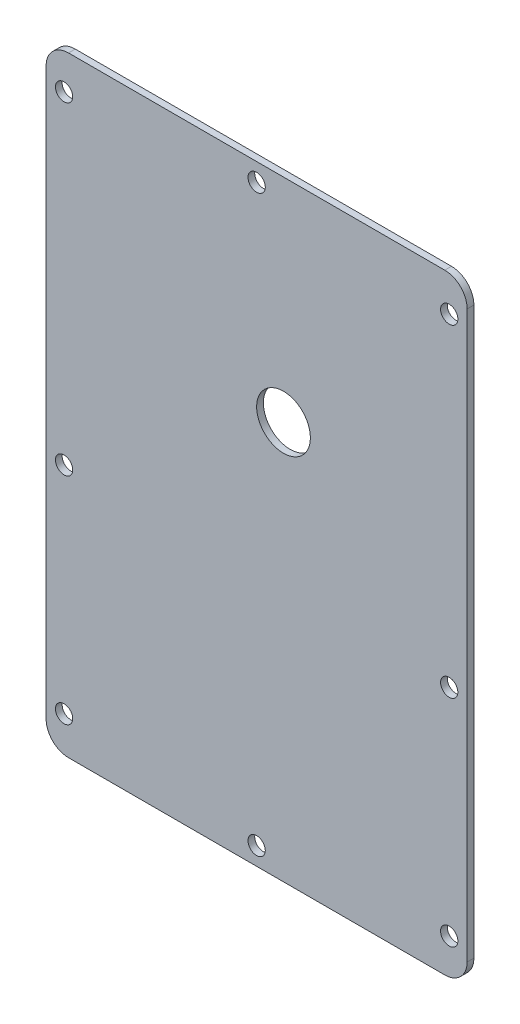
ISO-10303-21;
HEADER;
FILE_DESCRIPTION(('STEP AP214'),'2;1');
FILE_NAME('part.step','',(''),(''),'','','');
FILE_SCHEMA(('AUTOMOTIVE_DESIGN { 1 0 10303 214 1 1 1 1 }'));
ENDSEC;
DATA;
#1=APPLICATION_CONTEXT('core data for automotive mechanical design processes');
#2=APPLICATION_PROTOCOL_DEFINITION('international standard','automotive_design',2000,#1);
#3=PRODUCT_CONTEXT('',#1,'mechanical');
#4=PRODUCT('Part','Part','',(#3));
#5=PRODUCT_RELATED_PRODUCT_CATEGORY('part','',(#4));
#6=PRODUCT_DEFINITION_FORMATION('','',#4);
#7=PRODUCT_DEFINITION_CONTEXT('part definition',#1,'design');
#8=PRODUCT_DEFINITION('design','',#6,#7);
#9=PRODUCT_DEFINITION_SHAPE('','',#8);
#10=(LENGTH_UNIT() NAMED_UNIT(*) SI_UNIT(.MILLI.,.METRE.));
#11=(NAMED_UNIT(*) PLANE_ANGLE_UNIT() SI_UNIT($,.RADIAN.));
#12=(NAMED_UNIT(*) SI_UNIT($,.STERADIAN.) SOLID_ANGLE_UNIT());
#13=UNCERTAINTY_MEASURE_WITH_UNIT(LENGTH_MEASURE(1.E-05),#10,'distance_accuracy_value','');
#14=(GEOMETRIC_REPRESENTATION_CONTEXT(3) GLOBAL_UNCERTAINTY_ASSIGNED_CONTEXT((#13)) GLOBAL_UNIT_ASSIGNED_CONTEXT((#10,
#11,#12)) REPRESENTATION_CONTEXT('',''));
#15=CARTESIAN_POINT('',(0.,0.,0.));
#16=DIRECTION('',(0.,0.,1.));
#17=DIRECTION('',(1.,0.,0.));
#18=AXIS2_PLACEMENT_3D('',#15,#16,#17);
#19=CARTESIAN_POINT('',(47.0195351846494,-9.76000328568767,1.5));
#20=DIRECTION('',(-1.,0.,0.));
#21=DIRECTION('',(0.,0.,1.));
#22=AXIS2_PLACEMENT_3D('',#19,#20,#21);
#23=PLANE('',#22);
#24=DIRECTION('',(0.,1.,0.));
#25=VECTOR('',#24,1.);
#26=CARTESIAN_POINT('',(47.0195351846494,-9.76000328568767,1.5));
#27=LINE('',#26,#25);
#28=CARTESIAN_POINT('',(47.0195351846494,-4.76000328568767,1.5));
#29=VERTEX_POINT('',#28);
#30=CARTESIAN_POINT('',(47.0195351846494,121.572094853352,1.5));
#31=VERTEX_POINT('',#30);
#32=EDGE_CURVE('E132',#29,#31,#27,.T.);
#33=ORIENTED_EDGE('',*,*,#32,.F.);
#34=DIRECTION('',(0.,0.,-1.));
#35=VECTOR('',#34,1.);
#36=CARTESIAN_POINT('',(47.0195351846494,-4.76000328568767,1.5));
#37=LINE('',#36,#35);
#38=CARTESIAN_POINT('',(47.0195351846494,-4.76000328568767,0.));
#39=VERTEX_POINT('',#38);
#40=EDGE_CURVE('E117',#29,#39,#37,.T.);
#41=ORIENTED_EDGE('',*,*,#40,.T.);
#42=DIRECTION('',(0.,1.,0.));
#43=VECTOR('',#42,1.);
#44=CARTESIAN_POINT('',(47.0195351846494,-9.76000328568767,0.));
#45=LINE('',#44,#43);
#46=CARTESIAN_POINT('',(47.0195351846494,121.572094853352,0.));
#47=VERTEX_POINT('',#46);
#48=EDGE_CURVE('E129',#39,#47,#45,.T.);
#49=ORIENTED_EDGE('',*,*,#48,.T.);
#50=DIRECTION('',(0.,0.,-1.));
#51=VECTOR('',#50,1.);
#52=CARTESIAN_POINT('',(47.0195351846494,121.572094853352,1.5));
#53=LINE('',#52,#51);
#54=EDGE_CURVE('E134',#47,#31,#53,.F.);
#55=ORIENTED_EDGE('',*,*,#54,.T.);
#56=EDGE_LOOP('',(#33,#41,#49,#55));
#57=FACE_BOUND('',#56,.T.);
#58=ADVANCED_FACE('F45',(#57),#23,.F.);
#59=CARTESIAN_POINT('',(47.0195351846494,126.572094853352,1.5));
#60=DIRECTION('',(0.,-1.,0.));
#61=DIRECTION('',(0.,0.,-1.));
#62=AXIS2_PLACEMENT_3D('',#59,#60,#61);
#63=PLANE('',#62);
#64=DIRECTION('',(-1.,0.,0.));
#65=VECTOR('',#64,1.);
#66=CARTESIAN_POINT('',(47.0195351846494,126.572094853352,0.));
#67=LINE('',#66,#65);
#68=CARTESIAN_POINT('',(42.0195351846494,126.572094853352,0.));
#69=VERTEX_POINT('',#68);
#70=CARTESIAN_POINT('',(-42.0195351846494,126.572094853352,0.));
#71=VERTEX_POINT('',#70);
#72=EDGE_CURVE('E138',#69,#71,#67,.T.);
#73=ORIENTED_EDGE('',*,*,#72,.T.);
#74=DIRECTION('',(0.,0.,-1.));
#75=VECTOR('',#74,1.);
#76=CARTESIAN_POINT('',(-42.0195351846494,126.572094853352,1.5));
#77=LINE('',#76,#75);
#78=CARTESIAN_POINT('',(-42.0195351846494,126.572094853352,1.5));
#79=VERTEX_POINT('',#78);
#80=EDGE_CURVE('E11',#71,#79,#77,.F.);
#81=ORIENTED_EDGE('',*,*,#80,.T.);
#82=DIRECTION('',(-1.,0.,0.));
#83=VECTOR('',#82,1.);
#84=CARTESIAN_POINT('',(47.0195351846494,126.572094853352,1.5));
#85=LINE('',#84,#83);
#86=CARTESIAN_POINT('',(42.0195351846494,126.572094853352,1.5));
#87=VERTEX_POINT('',#86);
#88=EDGE_CURVE('E216',#87,#79,#85,.T.);
#89=ORIENTED_EDGE('',*,*,#88,.F.);
#90=DIRECTION('',(0.,0.,-1.));
#91=VECTOR('',#90,1.);
#92=CARTESIAN_POINT('',(42.0195351846494,126.572094853352,1.5));
#93=LINE('',#92,#91);
#94=EDGE_CURVE('E54',#87,#69,#93,.T.);
#95=ORIENTED_EDGE('',*,*,#94,.T.);
#96=EDGE_LOOP('',(#73,#81,#89,#95));
#97=FACE_BOUND('',#96,.T.);
#98=ADVANCED_FACE('F234',(#97),#63,.F.);
#99=CARTESIAN_POINT('',(-47.0195351846494,-9.76000328568767,1.5));
#100=DIRECTION('',(1.,0.,0.));
#101=DIRECTION('',(0.,0.,-1.));
#102=AXIS2_PLACEMENT_3D('',#99,#100,#101);
#103=PLANE('',#102);
#104=DIRECTION('',(0.,-1.,0.));
#105=VECTOR('',#104,1.);
#106=CARTESIAN_POINT('',(-47.0195351846494,-9.76000328568767,0.));
#107=LINE('',#106,#105);
#108=CARTESIAN_POINT('',(-47.0195351846494,121.572094853352,0.));
#109=VERTEX_POINT('',#108);
#110=CARTESIAN_POINT('',(-47.0195351846494,-4.76000328568767,0.));
#111=VERTEX_POINT('',#110);
#112=EDGE_CURVE('E142',#109,#111,#107,.T.);
#113=ORIENTED_EDGE('',*,*,#112,.T.);
#114=DIRECTION('',(0.,0.,-1.));
#115=VECTOR('',#114,1.);
#116=CARTESIAN_POINT('',(-47.0195351846494,-4.76000328568767,1.5));
#117=LINE('',#116,#115);
#118=CARTESIAN_POINT('',(-47.0195351846494,-4.76000328568767,1.5));
#119=VERTEX_POINT('',#118);
#120=EDGE_CURVE('E62',#111,#119,#117,.F.);
#121=ORIENTED_EDGE('',*,*,#120,.T.);
#122=DIRECTION('',(0.,-1.,0.));
#123=VECTOR('',#122,1.);
#124=CARTESIAN_POINT('',(-47.0195351846494,-9.76000328568767,1.5));
#125=LINE('',#124,#123);
#126=CARTESIAN_POINT('',(-47.0195351846494,121.572094853352,1.5));
#127=VERTEX_POINT('',#126);
#128=EDGE_CURVE('E217',#127,#119,#125,.T.);
#129=ORIENTED_EDGE('',*,*,#128,.F.);
#130=DIRECTION('',(0.,0.,-1.));
#131=VECTOR('',#130,1.);
#132=CARTESIAN_POINT('',(-47.0195351846494,121.572094853352,1.5));
#133=LINE('',#132,#131);
#134=EDGE_CURVE('E169',#127,#109,#133,.T.);
#135=ORIENTED_EDGE('',*,*,#134,.T.);
#136=EDGE_LOOP('',(#113,#121,#129,#135));
#137=FACE_BOUND('',#136,.T.);
#138=ADVANCED_FACE('F228',(#137),#103,.F.);
#139=CARTESIAN_POINT('',(47.0195351846494,-9.76000328568767,1.5));
#140=DIRECTION('',(0.,1.,0.));
#141=DIRECTION('',(0.,0.,1.));
#142=AXIS2_PLACEMENT_3D('',#139,#140,#141);
#143=PLANE('',#142);
#144=DIRECTION('',(1.,0.,0.));
#145=VECTOR('',#144,1.);
#146=CARTESIAN_POINT('',(47.0195351846494,-9.76000328568767,0.));
#147=LINE('',#146,#145);
#148=CARTESIAN_POINT('',(-42.0195351846494,-9.76000328568767,0.));
#149=VERTEX_POINT('',#148);
#150=CARTESIAN_POINT('',(42.0195351846494,-9.76000328568767,0.));
#151=VERTEX_POINT('',#150);
#152=EDGE_CURVE('E152',#149,#151,#147,.T.);
#153=ORIENTED_EDGE('',*,*,#152,.T.);
#154=DIRECTION('',(0.,0.,-1.));
#155=VECTOR('',#154,1.);
#156=CARTESIAN_POINT('',(42.0195351846494,-9.76000328568767,1.5));
#157=LINE('',#156,#155);
#158=CARTESIAN_POINT('',(42.0195351846494,-9.76000328568767,1.5));
#159=VERTEX_POINT('',#158);
#160=EDGE_CURVE('E118',#151,#159,#157,.F.);
#161=ORIENTED_EDGE('',*,*,#160,.T.);
#162=DIRECTION('',(1.,0.,0.));
#163=VECTOR('',#162,1.);
#164=CARTESIAN_POINT('',(47.0195351846494,-9.76000328568767,1.5));
#165=LINE('',#164,#163);
#166=CARTESIAN_POINT('',(-42.0195351846494,-9.76000328568767,1.5));
#167=VERTEX_POINT('',#166);
#168=EDGE_CURVE('E148',#167,#159,#165,.T.);
#169=ORIENTED_EDGE('',*,*,#168,.F.);
#170=DIRECTION('',(0.,0.,-1.));
#171=VECTOR('',#170,1.);
#172=CARTESIAN_POINT('',(-42.0195351846494,-9.76000328568767,1.5));
#173=LINE('',#172,#171);
#174=EDGE_CURVE('E123',#167,#149,#173,.T.);
#175=ORIENTED_EDGE('',*,*,#174,.T.);
#176=EDGE_LOOP('',(#153,#161,#169,#175));
#177=FACE_BOUND('',#176,.T.);
#178=ADVANCED_FACE('F224',(#177),#143,.F.);
#179=CARTESIAN_POINT('',(0.,0.,1.5));
#180=DIRECTION('',(0.,0.,1.));
#181=DIRECTION('',(1.,0.,0.));
#182=AXIS2_PLACEMENT_3D('',#179,#180,#181);
#183=PLANE('',#182);
#184=CARTESIAN_POINT('',(6.00001877293246,79.140018508034,1.5));
#185=DIRECTION('',(0.,0.,1.));
#186=DIRECTION('',(1.,0.,0.));
#187=AXIS2_PLACEMENT_3D('',#184,#185,#186);
#188=CIRCLE('',#187,6.00000000000001);
#189=CARTESIAN_POINT('',(12.0000187729325,79.140018508034,1.5));
#190=VERTEX_POINT('',#189);
#191=EDGE_CURVE('E411',#190,#190,#188,.T.);
#192=ORIENTED_EDGE('',*,*,#191,.F.);
#193=EDGE_LOOP('',(#192));
#194=FACE_BOUND('',#193,.T.);
#195=CARTESIAN_POINT('',(43.0097675923247,118.552559668702,1.5));
#196=DIRECTION('',(0.,0.,1.));
#197=DIRECTION('',(1.,0.,0.));
#198=AXIS2_PLACEMENT_3D('',#195,#196,#197);
#199=CIRCLE('',#198,1.93039999999999);
#200=CARTESIAN_POINT('',(44.9401675923247,118.552559668702,1.5));
#201=VERTEX_POINT('',#200);
#202=EDGE_CURVE('E415',#201,#201,#199,.T.);
#203=ORIENTED_EDGE('',*,*,#202,.F.);
#204=EDGE_LOOP('',(#203));
#205=FACE_BOUND('',#204,.T.);
#206=CARTESIAN_POINT('',(43.0097675923247,46.3767430068579,1.5));
#207=DIRECTION('',(0.,0.,1.));
#208=DIRECTION('',(1.,0.,0.));
#209=AXIS2_PLACEMENT_3D('',#206,#207,#208);
#210=CIRCLE('',#209,1.93039999999999);
#211=CARTESIAN_POINT('',(44.9401675923247,46.3767430068579,1.5));
#212=VERTEX_POINT('',#211);
#213=EDGE_CURVE('E196',#212,#212,#210,.T.);
#214=ORIENTED_EDGE('',*,*,#213,.F.);
#215=EDGE_LOOP('',(#214));
#216=FACE_BOUND('',#215,.T.);
#217=CARTESIAN_POINT('',(43.0097675923247,-1.74046810103833,1.5));
#218=DIRECTION('',(0.,0.,1.));
#219=DIRECTION('',(1.,0.,0.));
#220=AXIS2_PLACEMENT_3D('',#217,#218,#219);
#221=CIRCLE('',#220,1.93039999999999);
#222=CARTESIAN_POINT('',(44.9401675923247,-1.74046810103833,1.5));
#223=VERTEX_POINT('',#222);
#224=EDGE_CURVE('E185',#223,#223,#221,.T.);
#225=ORIENTED_EDGE('',*,*,#224,.F.);
#226=EDGE_LOOP('',(#225));
#227=FACE_BOUND('',#226,.T.);
#228=CARTESIAN_POINT('',(-43.0097675923247,46.3767430068579,1.5));
#229=DIRECTION('',(0.,0.,1.));
#230=DIRECTION('',(1.,0.,0.));
#231=AXIS2_PLACEMENT_3D('',#228,#229,#230);
#232=CIRCLE('',#231,1.93039999999999);
#233=CARTESIAN_POINT('',(-41.0793675923247,46.3767430068579,1.5));
#234=VERTEX_POINT('',#233);
#235=EDGE_CURVE('E182',#234,#234,#232,.T.);
#236=ORIENTED_EDGE('',*,*,#235,.F.);
#237=EDGE_LOOP('',(#236));
#238=FACE_BOUND('',#237,.T.);
#239=CARTESIAN_POINT('',(-43.0097675923247,-1.74046810103834,1.5));
#240=DIRECTION('',(0.,0.,1.));
#241=DIRECTION('',(1.,0.,0.));
#242=AXIS2_PLACEMENT_3D('',#239,#240,#241);
#243=CIRCLE('',#242,1.93039999999999);
#244=CARTESIAN_POINT('',(-41.0793675923247,-1.74046810103834,1.5));
#245=VERTEX_POINT('',#244);
#246=EDGE_CURVE('E179',#245,#245,#243,.T.);
#247=ORIENTED_EDGE('',*,*,#246,.F.);
#248=EDGE_LOOP('',(#247));
#249=FACE_BOUND('',#248,.T.);
#250=CARTESIAN_POINT('',(0.,122.562327261027,1.5));
#251=DIRECTION('',(0.,0.,1.));
#252=DIRECTION('',(1.,0.,0.));
#253=AXIS2_PLACEMENT_3D('',#250,#251,#252);
#254=CIRCLE('',#253,1.93039999999999);
#255=CARTESIAN_POINT('',(1.93039999999999,122.562327261027,1.5));
#256=VERTEX_POINT('',#255);
#257=EDGE_CURVE('E178',#256,#256,#254,.T.);
#258=ORIENTED_EDGE('',*,*,#257,.F.);
#259=EDGE_LOOP('',(#258));
#260=FACE_BOUND('',#259,.T.);
#261=CARTESIAN_POINT('',(0.,-5.75023569336303,1.5));
#262=DIRECTION('',(0.,0.,1.));
#263=DIRECTION('',(1.,0.,0.));
#264=AXIS2_PLACEMENT_3D('',#261,#262,#263);
#265=CIRCLE('',#264,1.93039999999999);
#266=CARTESIAN_POINT('',(1.93039999999999,-5.75023569336303,1.5));
#267=VERTEX_POINT('',#266);
#268=EDGE_CURVE('E207',#267,#267,#265,.T.);
#269=ORIENTED_EDGE('',*,*,#268,.F.);
#270=EDGE_LOOP('',(#269));
#271=FACE_BOUND('',#270,.T.);
#272=CARTESIAN_POINT('',(-43.0097675923247,118.552559668702,1.5));
#273=DIRECTION('',(0.,0.,1.));
#274=DIRECTION('',(1.,0.,0.));
#275=AXIS2_PLACEMENT_3D('',#272,#273,#274);
#276=CIRCLE('',#275,1.93039999999999);
#277=CARTESIAN_POINT('',(-41.0793675923247,118.552559668702,1.5));
#278=VERTEX_POINT('',#277);
#279=EDGE_CURVE('E145',#278,#278,#276,.T.);
#280=ORIENTED_EDGE('',*,*,#279,.F.);
#281=EDGE_LOOP('',(#280));
#282=FACE_BOUND('',#281,.T.);
#283=ORIENTED_EDGE('',*,*,#168,.T.);
#284=CARTESIAN_POINT('',(42.0195351846494,-4.76000328568767,1.5));
#285=DIRECTION('',(0.,0.,1.));
#286=DIRECTION('',(1.,0.,0.));
#287=AXIS2_PLACEMENT_3D('',#284,#285,#286);
#288=CIRCLE('',#287,5.);
#289=EDGE_CURVE('E167',#159,#29,#288,.T.);
#290=ORIENTED_EDGE('',*,*,#289,.T.);
#291=ORIENTED_EDGE('',*,*,#32,.T.);
#292=CARTESIAN_POINT('',(42.0195351846494,121.572094853352,1.5));
#293=DIRECTION('',(0.,0.,1.));
#294=DIRECTION('',(1.,0.,0.));
#295=AXIS2_PLACEMENT_3D('',#292,#293,#294);
#296=CIRCLE('',#295,5.);
#297=EDGE_CURVE('E162',#31,#87,#296,.T.);
#298=ORIENTED_EDGE('',*,*,#297,.T.);
#299=ORIENTED_EDGE('',*,*,#88,.T.);
#300=CARTESIAN_POINT('',(-42.0195351846494,121.572094853352,1.5));
#301=DIRECTION('',(0.,0.,1.));
#302=DIRECTION('',(1.,0.,0.));
#303=AXIS2_PLACEMENT_3D('',#300,#301,#302);
#304=CIRCLE('',#303,5.);
#305=EDGE_CURVE('E69',#79,#127,#304,.T.);
#306=ORIENTED_EDGE('',*,*,#305,.T.);
#307=ORIENTED_EDGE('',*,*,#128,.T.);
#308=CARTESIAN_POINT('',(-42.0195351846494,-4.76000328568767,1.5));
#309=DIRECTION('',(0.,0.,1.));
#310=DIRECTION('',(1.,0.,0.));
#311=AXIS2_PLACEMENT_3D('',#308,#309,#310);
#312=CIRCLE('',#311,5.);
#313=EDGE_CURVE('E165',#119,#167,#312,.T.);
#314=ORIENTED_EDGE('',*,*,#313,.T.);
#315=EDGE_LOOP('',(#283,#290,#291,#298,#299,#306,#307,#314));
#316=FACE_BOUND('',#315,.T.);
#317=ADVANCED_FACE('F221',(#194,#205,#216,#227,#238,#249,#260,#271,#282,#316),#183,.T.);
#318=CARTESIAN_POINT('',(0.,0.,0.));
#319=DIRECTION('',(0.,0.,1.));
#320=DIRECTION('',(1.,0.,0.));
#321=AXIS2_PLACEMENT_3D('',#318,#319,#320);
#322=PLANE('',#321);
#323=CARTESIAN_POINT('',(6.00001877293246,79.140018508034,0.));
#324=DIRECTION('',(0.,0.,1.));
#325=DIRECTION('',(1.,0.,0.));
#326=AXIS2_PLACEMENT_3D('',#323,#324,#325);
#327=CIRCLE('',#326,6.00000000000001);
#328=CARTESIAN_POINT('',(12.0000187729325,79.140018508034,0.));
#329=VERTEX_POINT('',#328);
#330=EDGE_CURVE('E447',#329,#329,#327,.T.);
#331=ORIENTED_EDGE('',*,*,#330,.T.);
#332=EDGE_LOOP('',(#331));
#333=FACE_BOUND('',#332,.T.);
#334=CARTESIAN_POINT('',(43.0097675923247,118.552559668702,0.));
#335=DIRECTION('',(0.,0.,1.));
#336=DIRECTION('',(1.,0.,0.));
#337=AXIS2_PLACEMENT_3D('',#334,#335,#336);
#338=CIRCLE('',#337,1.93039999999999);
#339=CARTESIAN_POINT('',(44.9401675923247,118.552559668702,0.));
#340=VERTEX_POINT('',#339);
#341=EDGE_CURVE('E49',#340,#340,#338,.T.);
#342=ORIENTED_EDGE('',*,*,#341,.T.);
#343=EDGE_LOOP('',(#342));
#344=FACE_BOUND('',#343,.T.);
#345=CARTESIAN_POINT('',(43.0097675923247,46.3767430068579,0.));
#346=DIRECTION('',(0.,0.,1.));
#347=DIRECTION('',(1.,0.,0.));
#348=AXIS2_PLACEMENT_3D('',#345,#346,#347);
#349=CIRCLE('',#348,1.93039999999999);
#350=CARTESIAN_POINT('',(44.9401675923247,46.3767430068579,0.));
#351=VERTEX_POINT('',#350);
#352=EDGE_CURVE('E191',#351,#351,#349,.T.);
#353=ORIENTED_EDGE('',*,*,#352,.T.);
#354=EDGE_LOOP('',(#353));
#355=FACE_BOUND('',#354,.T.);
#356=CARTESIAN_POINT('',(43.0097675923247,-1.74046810103833,0.));
#357=DIRECTION('',(0.,0.,1.));
#358=DIRECTION('',(1.,0.,0.));
#359=AXIS2_PLACEMENT_3D('',#356,#357,#358);
#360=CIRCLE('',#359,1.93039999999999);
#361=CARTESIAN_POINT('',(44.9401675923247,-1.74046810103833,0.));
#362=VERTEX_POINT('',#361);
#363=EDGE_CURVE('E183',#362,#362,#360,.T.);
#364=ORIENTED_EDGE('',*,*,#363,.T.);
#365=EDGE_LOOP('',(#364));
#366=FACE_BOUND('',#365,.T.);
#367=CARTESIAN_POINT('',(-43.0097675923247,46.3767430068579,0.));
#368=DIRECTION('',(0.,0.,1.));
#369=DIRECTION('',(1.,0.,0.));
#370=AXIS2_PLACEMENT_3D('',#367,#368,#369);
#371=CIRCLE('',#370,1.93039999999999);
#372=CARTESIAN_POINT('',(-41.0793675923247,46.3767430068579,0.));
#373=VERTEX_POINT('',#372);
#374=EDGE_CURVE('E180',#373,#373,#371,.T.);
#375=ORIENTED_EDGE('',*,*,#374,.T.);
#376=EDGE_LOOP('',(#375));
#377=FACE_BOUND('',#376,.T.);
#378=CARTESIAN_POINT('',(-43.0097675923247,-1.74046810103834,0.));
#379=DIRECTION('',(0.,0.,1.));
#380=DIRECTION('',(1.,0.,0.));
#381=AXIS2_PLACEMENT_3D('',#378,#379,#380);
#382=CIRCLE('',#381,1.93039999999999);
#383=CARTESIAN_POINT('',(-41.0793675923247,-1.74046810103834,0.));
#384=VERTEX_POINT('',#383);
#385=EDGE_CURVE('E175',#384,#384,#382,.T.);
#386=ORIENTED_EDGE('',*,*,#385,.T.);
#387=EDGE_LOOP('',(#386));
#388=FACE_BOUND('',#387,.T.);
#389=CARTESIAN_POINT('',(0.,122.562327261027,0.));
#390=DIRECTION('',(0.,0.,1.));
#391=DIRECTION('',(1.,0.,0.));
#392=AXIS2_PLACEMENT_3D('',#389,#390,#391);
#393=CIRCLE('',#392,1.93039999999999);
#394=CARTESIAN_POINT('',(1.93039999999999,122.562327261027,0.));
#395=VERTEX_POINT('',#394);
#396=EDGE_CURVE('E204',#395,#395,#393,.T.);
#397=ORIENTED_EDGE('',*,*,#396,.T.);
#398=EDGE_LOOP('',(#397));
#399=FACE_BOUND('',#398,.T.);
#400=CARTESIAN_POINT('',(0.,-5.75023569336303,0.));
#401=DIRECTION('',(0.,0.,1.));
#402=DIRECTION('',(1.,0.,0.));
#403=AXIS2_PLACEMENT_3D('',#400,#401,#402);
#404=CIRCLE('',#403,1.93039999999999);
#405=CARTESIAN_POINT('',(1.93039999999999,-5.75023569336303,0.));
#406=VERTEX_POINT('',#405);
#407=EDGE_CURVE('E210',#406,#406,#404,.T.);
#408=ORIENTED_EDGE('',*,*,#407,.T.);
#409=EDGE_LOOP('',(#408));
#410=FACE_BOUND('',#409,.T.);
#411=CARTESIAN_POINT('',(-43.0097675923247,118.552559668702,0.));
#412=DIRECTION('',(0.,0.,1.));
#413=DIRECTION('',(1.,0.,0.));
#414=AXIS2_PLACEMENT_3D('',#411,#412,#413);
#415=CIRCLE('',#414,1.93039999999999);
#416=CARTESIAN_POINT('',(-41.0793675923247,118.552559668702,0.));
#417=VERTEX_POINT('',#416);
#418=EDGE_CURVE('E139',#417,#417,#415,.T.);
#419=ORIENTED_EDGE('',*,*,#418,.T.);
#420=EDGE_LOOP('',(#419));
#421=FACE_BOUND('',#420,.T.);
#422=ORIENTED_EDGE('',*,*,#48,.F.);
#423=CARTESIAN_POINT('',(42.0195351846494,-4.76000328568767,0.));
#424=DIRECTION('',(0.,0.,1.));
#425=DIRECTION('',(1.,0.,0.));
#426=AXIS2_PLACEMENT_3D('',#423,#424,#425);
#427=CIRCLE('',#426,5.);
#428=EDGE_CURVE('E113',#39,#151,#427,.F.);
#429=ORIENTED_EDGE('',*,*,#428,.T.);
#430=ORIENTED_EDGE('',*,*,#152,.F.);
#431=CARTESIAN_POINT('',(-42.0195351846494,-4.76000328568767,0.));
#432=DIRECTION('',(0.,0.,1.));
#433=DIRECTION('',(1.,0.,0.));
#434=AXIS2_PLACEMENT_3D('',#431,#432,#433);
#435=CIRCLE('',#434,5.);
#436=EDGE_CURVE('E124',#149,#111,#435,.F.);
#437=ORIENTED_EDGE('',*,*,#436,.T.);
#438=ORIENTED_EDGE('',*,*,#112,.F.);
#439=CARTESIAN_POINT('',(-42.0195351846494,121.572094853352,0.));
#440=DIRECTION('',(0.,0.,1.));
#441=DIRECTION('',(1.,0.,0.));
#442=AXIS2_PLACEMENT_3D('',#439,#440,#441);
#443=CIRCLE('',#442,5.);
#444=EDGE_CURVE('E156',#109,#71,#443,.F.);
#445=ORIENTED_EDGE('',*,*,#444,.T.);
#446=ORIENTED_EDGE('',*,*,#72,.F.);
#447=CARTESIAN_POINT('',(42.0195351846494,121.572094853352,0.));
#448=DIRECTION('',(0.,0.,1.));
#449=DIRECTION('',(1.,0.,0.));
#450=AXIS2_PLACEMENT_3D('',#447,#448,#449);
#451=CIRCLE('',#450,5.);
#452=EDGE_CURVE('E133',#69,#47,#451,.F.);
#453=ORIENTED_EDGE('',*,*,#452,.T.);
#454=EDGE_LOOP('',(#422,#429,#430,#437,#438,#445,#446,#453));
#455=FACE_BOUND('',#454,.T.);
#456=ADVANCED_FACE('F136',(#333,#344,#355,#366,#377,#388,#399,#410,#421,#455),#322,.F.);
#457=CARTESIAN_POINT('',(42.0195351846494,-4.76000328568767,1.5));
#458=DIRECTION('',(0.,0.,-1.));
#459=DIRECTION('',(-1.,0.,0.));
#460=AXIS2_PLACEMENT_3D('',#457,#458,#459);
#461=CYLINDRICAL_SURFACE('',#460,5.);
#462=ORIENTED_EDGE('',*,*,#289,.F.);
#463=ORIENTED_EDGE('',*,*,#160,.F.);
#464=ORIENTED_EDGE('',*,*,#428,.F.);
#465=ORIENTED_EDGE('',*,*,#40,.F.);
#466=EDGE_LOOP('',(#462,#463,#464,#465));
#467=FACE_BOUND('',#466,.T.);
#468=ADVANCED_FACE('F116',(#467),#461,.T.);
#469=CARTESIAN_POINT('',(-42.0195351846494,-4.76000328568767,1.5));
#470=DIRECTION('',(0.,0.,-1.));
#471=DIRECTION('',(-1.,0.,0.));
#472=AXIS2_PLACEMENT_3D('',#469,#470,#471);
#473=CYLINDRICAL_SURFACE('',#472,5.);
#474=ORIENTED_EDGE('',*,*,#313,.F.);
#475=ORIENTED_EDGE('',*,*,#120,.F.);
#476=ORIENTED_EDGE('',*,*,#436,.F.);
#477=ORIENTED_EDGE('',*,*,#174,.F.);
#478=EDGE_LOOP('',(#474,#475,#476,#477));
#479=FACE_BOUND('',#478,.T.);
#480=ADVANCED_FACE('F226',(#479),#473,.T.);
#481=CARTESIAN_POINT('',(-42.0195351846494,121.572094853352,1.5));
#482=DIRECTION('',(0.,0.,-1.));
#483=DIRECTION('',(-1.,0.,0.));
#484=AXIS2_PLACEMENT_3D('',#481,#482,#483);
#485=CYLINDRICAL_SURFACE('',#484,5.);
#486=ORIENTED_EDGE('',*,*,#305,.F.);
#487=ORIENTED_EDGE('',*,*,#80,.F.);
#488=ORIENTED_EDGE('',*,*,#444,.F.);
#489=ORIENTED_EDGE('',*,*,#134,.F.);
#490=EDGE_LOOP('',(#486,#487,#488,#489));
#491=FACE_BOUND('',#490,.T.);
#492=ADVANCED_FACE('F231',(#491),#485,.T.);
#493=CARTESIAN_POINT('',(42.0195351846494,121.572094853352,1.5));
#494=DIRECTION('',(0.,0.,-1.));
#495=DIRECTION('',(-1.,0.,0.));
#496=AXIS2_PLACEMENT_3D('',#493,#494,#495);
#497=CYLINDRICAL_SURFACE('',#496,5.);
#498=ORIENTED_EDGE('',*,*,#297,.F.);
#499=ORIENTED_EDGE('',*,*,#54,.F.);
#500=ORIENTED_EDGE('',*,*,#452,.F.);
#501=ORIENTED_EDGE('',*,*,#94,.F.);
#502=EDGE_LOOP('',(#498,#499,#500,#501));
#503=FACE_BOUND('',#502,.T.);
#504=ADVANCED_FACE('F47',(#503),#497,.T.);
#505=CARTESIAN_POINT('',(-43.0097675923247,118.552559668702,1.5));
#506=DIRECTION('',(0.,0.,1.));
#507=DIRECTION('',(1.,0.,0.));
#508=AXIS2_PLACEMENT_3D('',#505,#506,#507);
#509=CYLINDRICAL_SURFACE('',#508,1.93039999999999);
#510=ORIENTED_EDGE('',*,*,#279,.T.);
#511=EDGE_LOOP('',(#510));
#512=FACE_BOUND('',#511,.T.);
#513=ORIENTED_EDGE('',*,*,#418,.F.);
#514=EDGE_LOOP('',(#513));
#515=FACE_BOUND('',#514,.T.);
#516=ADVANCED_FACE('F240',(#512,#515),#509,.F.);
#517=CARTESIAN_POINT('',(0.,-5.75023569336303,1.5));
#518=DIRECTION('',(0.,0.,1.));
#519=DIRECTION('',(1.,0.,0.));
#520=AXIS2_PLACEMENT_3D('',#517,#518,#519);
#521=CYLINDRICAL_SURFACE('',#520,1.93039999999999);
#522=ORIENTED_EDGE('',*,*,#268,.T.);
#523=EDGE_LOOP('',(#522));
#524=FACE_BOUND('',#523,.T.);
#525=ORIENTED_EDGE('',*,*,#407,.F.);
#526=EDGE_LOOP('',(#525));
#527=FACE_BOUND('',#526,.T.);
#528=ADVANCED_FACE('F245',(#524,#527),#521,.F.);
#529=CARTESIAN_POINT('',(0.,122.562327261027,1.5));
#530=DIRECTION('',(0.,0.,1.));
#531=DIRECTION('',(1.,0.,0.));
#532=AXIS2_PLACEMENT_3D('',#529,#530,#531);
#533=CYLINDRICAL_SURFACE('',#532,1.93039999999999);
#534=ORIENTED_EDGE('',*,*,#257,.T.);
#535=EDGE_LOOP('',(#534));
#536=FACE_BOUND('',#535,.T.);
#537=ORIENTED_EDGE('',*,*,#396,.F.);
#538=EDGE_LOOP('',(#537));
#539=FACE_BOUND('',#538,.T.);
#540=ADVANCED_FACE('F289',(#536,#539),#533,.F.);
#541=CARTESIAN_POINT('',(-43.0097675923247,-1.74046810103834,1.5));
#542=DIRECTION('',(0.,0.,1.));
#543=DIRECTION('',(1.,0.,0.));
#544=AXIS2_PLACEMENT_3D('',#541,#542,#543);
#545=CYLINDRICAL_SURFACE('',#544,1.93039999999999);
#546=ORIENTED_EDGE('',*,*,#246,.T.);
#547=EDGE_LOOP('',(#546));
#548=FACE_BOUND('',#547,.T.);
#549=ORIENTED_EDGE('',*,*,#385,.F.);
#550=EDGE_LOOP('',(#549));
#551=FACE_BOUND('',#550,.T.);
#552=ADVANCED_FACE('F299',(#548,#551),#545,.F.);
#553=CARTESIAN_POINT('',(-43.0097675923247,46.3767430068579,1.5));
#554=DIRECTION('',(0.,0.,1.));
#555=DIRECTION('',(1.,0.,0.));
#556=AXIS2_PLACEMENT_3D('',#553,#554,#555);
#557=CYLINDRICAL_SURFACE('',#556,1.93039999999999);
#558=ORIENTED_EDGE('',*,*,#235,.T.);
#559=EDGE_LOOP('',(#558));
#560=FACE_BOUND('',#559,.T.);
#561=ORIENTED_EDGE('',*,*,#374,.F.);
#562=EDGE_LOOP('',(#561));
#563=FACE_BOUND('',#562,.T.);
#564=ADVANCED_FACE('F309',(#560,#563),#557,.F.);
#565=CARTESIAN_POINT('',(43.0097675923247,-1.74046810103833,1.5));
#566=DIRECTION('',(0.,0.,1.));
#567=DIRECTION('',(1.,0.,0.));
#568=AXIS2_PLACEMENT_3D('',#565,#566,#567);
#569=CYLINDRICAL_SURFACE('',#568,1.93039999999999);
#570=ORIENTED_EDGE('',*,*,#224,.T.);
#571=EDGE_LOOP('',(#570));
#572=FACE_BOUND('',#571,.T.);
#573=ORIENTED_EDGE('',*,*,#363,.F.);
#574=EDGE_LOOP('',(#573));
#575=FACE_BOUND('',#574,.T.);
#576=ADVANCED_FACE('F319',(#572,#575),#569,.F.);
#577=CARTESIAN_POINT('',(43.0097675923247,46.3767430068579,1.5));
#578=DIRECTION('',(0.,0.,1.));
#579=DIRECTION('',(1.,0.,0.));
#580=AXIS2_PLACEMENT_3D('',#577,#578,#579);
#581=CYLINDRICAL_SURFACE('',#580,1.93039999999999);
#582=ORIENTED_EDGE('',*,*,#213,.T.);
#583=EDGE_LOOP('',(#582));
#584=FACE_BOUND('',#583,.T.);
#585=ORIENTED_EDGE('',*,*,#352,.F.);
#586=EDGE_LOOP('',(#585));
#587=FACE_BOUND('',#586,.T.);
#588=ADVANCED_FACE('F329',(#584,#587),#581,.F.);
#589=CARTESIAN_POINT('',(43.0097675923247,118.552559668702,1.5));
#590=DIRECTION('',(0.,0.,1.));
#591=DIRECTION('',(1.,0.,0.));
#592=AXIS2_PLACEMENT_3D('',#589,#590,#591);
#593=CYLINDRICAL_SURFACE('',#592,1.93039999999999);
#594=ORIENTED_EDGE('',*,*,#202,.T.);
#595=EDGE_LOOP('',(#594));
#596=FACE_BOUND('',#595,.T.);
#597=ORIENTED_EDGE('',*,*,#341,.F.);
#598=EDGE_LOOP('',(#597));
#599=FACE_BOUND('',#598,.T.);
#600=ADVANCED_FACE('F338',(#596,#599),#593,.F.);
#601=CARTESIAN_POINT('',(6.00001877293246,79.140018508034,0.));
#602=DIRECTION('',(0.,0.,1.));
#603=DIRECTION('',(1.,0.,0.));
#604=AXIS2_PLACEMENT_3D('',#601,#602,#603);
#605=CYLINDRICAL_SURFACE('',#604,6.00000000000001);
#606=ORIENTED_EDGE('',*,*,#330,.F.);
#607=EDGE_LOOP('',(#606));
#608=FACE_BOUND('',#607,.T.);
#609=ORIENTED_EDGE('',*,*,#191,.T.);
#610=EDGE_LOOP('',(#609));
#611=FACE_BOUND('',#610,.T.);
#612=ADVANCED_FACE('F348',(#608,#611),#605,.F.);
#613=CLOSED_SHELL('',(#58,#98,#138,#178,#317,#456,#468,#480,#492,#504,#516,#528,#540,#552,#564,
#576,#588,#600,#612));
#614=MANIFOLD_SOLID_BREP('B2',#613);
#615=ADVANCED_BREP_SHAPE_REPRESENTATION('',(#18,#614),#14);
#616=SHAPE_DEFINITION_REPRESENTATION(#9,#615);
ENDSEC;
END-ISO-10303-21;
